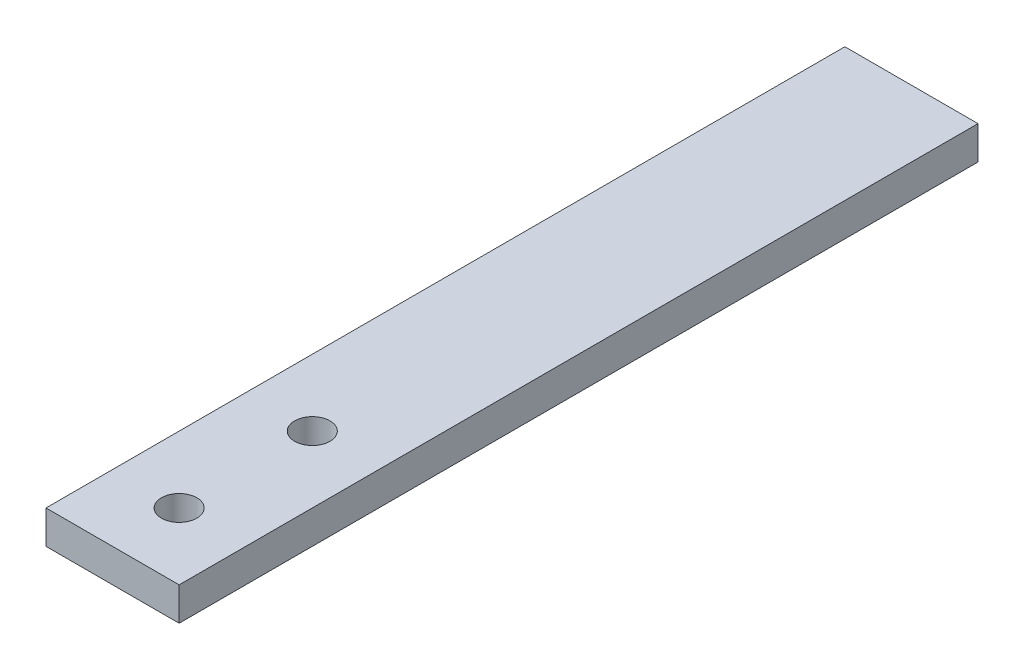
ISO-10303-21;
HEADER;
FILE_DESCRIPTION(('STEP AP214'),'2;1');
FILE_NAME('part.step','',(''),(''),'','','');
FILE_SCHEMA(('AUTOMOTIVE_DESIGN { 1 0 10303 214 1 1 1 1 }'));
ENDSEC;
DATA;
#1=APPLICATION_CONTEXT('core data for automotive mechanical design processes');
#2=APPLICATION_PROTOCOL_DEFINITION('international standard','automotive_design',2000,#1);
#3=PRODUCT_CONTEXT('',#1,'mechanical');
#4=PRODUCT('Part','Part','',(#3));
#5=PRODUCT_RELATED_PRODUCT_CATEGORY('part','',(#4));
#6=PRODUCT_DEFINITION_FORMATION('','',#4);
#7=PRODUCT_DEFINITION_CONTEXT('part definition',#1,'design');
#8=PRODUCT_DEFINITION('design','',#6,#7);
#9=PRODUCT_DEFINITION_SHAPE('','',#8);
#10=(LENGTH_UNIT() NAMED_UNIT(*) SI_UNIT(.MILLI.,.METRE.));
#11=(NAMED_UNIT(*) PLANE_ANGLE_UNIT() SI_UNIT($,.RADIAN.));
#12=(NAMED_UNIT(*) SI_UNIT($,.STERADIAN.) SOLID_ANGLE_UNIT());
#13=UNCERTAINTY_MEASURE_WITH_UNIT(LENGTH_MEASURE(1.E-05),#10,'distance_accuracy_value','');
#14=(GEOMETRIC_REPRESENTATION_CONTEXT(3) GLOBAL_UNCERTAINTY_ASSIGNED_CONTEXT((#13)) GLOBAL_UNIT_ASSIGNED_CONTEXT((#10,
#11,#12)) REPRESENTATION_CONTEXT('',''));
#15=CARTESIAN_POINT('',(0.,0.,0.));
#16=DIRECTION('',(0.,0.,1.));
#17=DIRECTION('',(1.,0.,0.));
#18=AXIS2_PLACEMENT_3D('',#15,#16,#17);
#19=CARTESIAN_POINT('',(-12.7,3.175,76.2));
#20=DIRECTION('',(-1.,0.,0.));
#21=DIRECTION('',(0.,0.,1.));
#22=AXIS2_PLACEMENT_3D('',#19,#20,#21);
#23=PLANE('',#22);
#24=DIRECTION('',(0.,0.,-1.));
#25=VECTOR('',#24,1.);
#26=CARTESIAN_POINT('',(-12.7,-3.175,76.2));
#27=LINE('',#26,#25);
#28=CARTESIAN_POINT('',(-12.7,-3.175,76.2));
#29=VERTEX_POINT('',#28);
#30=CARTESIAN_POINT('',(-12.7,-3.175,-76.2));
#31=VERTEX_POINT('',#30);
#32=EDGE_CURVE('E111',#29,#31,#27,.T.);
#33=ORIENTED_EDGE('',*,*,#32,.F.);
#34=DIRECTION('',(0.,-1.,0.));
#35=VECTOR('',#34,1.);
#36=CARTESIAN_POINT('',(-12.7,3.175,76.2));
#37=LINE('',#36,#35);
#38=CARTESIAN_POINT('',(-12.7,3.175,76.2));
#39=VERTEX_POINT('',#38);
#40=EDGE_CURVE('E11',#39,#29,#37,.T.);
#41=ORIENTED_EDGE('',*,*,#40,.F.);
#42=DIRECTION('',(0.,0.,-1.));
#43=VECTOR('',#42,1.);
#44=CARTESIAN_POINT('',(-12.7,3.175,76.2));
#45=LINE('',#44,#43);
#46=CARTESIAN_POINT('',(-12.7,3.175,-76.2));
#47=VERTEX_POINT('',#46);
#48=EDGE_CURVE('E103',#39,#47,#45,.T.);
#49=ORIENTED_EDGE('',*,*,#48,.T.);
#50=DIRECTION('',(0.,-1.,0.));
#51=VECTOR('',#50,1.);
#52=CARTESIAN_POINT('',(-12.7,3.175,-76.2));
#53=LINE('',#52,#51);
#54=EDGE_CURVE('E42',#47,#31,#53,.T.);
#55=ORIENTED_EDGE('',*,*,#54,.T.);
#56=EDGE_LOOP('',(#33,#41,#49,#55));
#57=FACE_BOUND('',#56,.T.);
#58=ADVANCED_FACE('F39',(#57),#23,.T.);
#59=CARTESIAN_POINT('',(-12.7,3.175,76.2));
#60=DIRECTION('',(0.,0.,-1.));
#61=DIRECTION('',(-1.,0.,0.));
#62=AXIS2_PLACEMENT_3D('',#59,#60,#61);
#63=PLANE('',#62);
#64=DIRECTION('',(1.,0.,0.));
#65=VECTOR('',#64,1.);
#66=CARTESIAN_POINT('',(-12.7,-3.175,76.2));
#67=LINE('',#66,#65);
#68=CARTESIAN_POINT('',(12.7,-3.175,76.2));
#69=VERTEX_POINT('',#68);
#70=EDGE_CURVE('E73',#29,#69,#67,.T.);
#71=ORIENTED_EDGE('',*,*,#70,.T.);
#72=DIRECTION('',(0.,-1.,0.));
#73=VECTOR('',#72,1.);
#74=CARTESIAN_POINT('',(12.7,3.175,76.2));
#75=LINE('',#74,#73);
#76=CARTESIAN_POINT('',(12.7,3.175,76.2));
#77=VERTEX_POINT('',#76);
#78=EDGE_CURVE('E49',#77,#69,#75,.T.);
#79=ORIENTED_EDGE('',*,*,#78,.F.);
#80=DIRECTION('',(1.,0.,0.));
#81=VECTOR('',#80,1.);
#82=CARTESIAN_POINT('',(-12.7,3.175,76.2));
#83=LINE('',#82,#81);
#84=EDGE_CURVE('E90',#39,#77,#83,.T.);
#85=ORIENTED_EDGE('',*,*,#84,.F.);
#86=ORIENTED_EDGE('',*,*,#40,.T.);
#87=EDGE_LOOP('',(#71,#79,#85,#86));
#88=FACE_BOUND('',#87,.T.);
#89=ADVANCED_FACE('F128',(#88),#63,.F.);
#90=CARTESIAN_POINT('',(12.7,3.175,76.2));
#91=DIRECTION('',(-1.,0.,0.));
#92=DIRECTION('',(0.,0.,1.));
#93=AXIS2_PLACEMENT_3D('',#90,#91,#92);
#94=PLANE('',#93);
#95=DIRECTION('',(0.,0.,-1.));
#96=VECTOR('',#95,1.);
#97=CARTESIAN_POINT('',(12.7,-3.175,76.2));
#98=LINE('',#97,#96);
#99=CARTESIAN_POINT('',(12.7,-3.175,-76.2));
#100=VERTEX_POINT('',#99);
#101=EDGE_CURVE('E98',#69,#100,#98,.T.);
#102=ORIENTED_EDGE('',*,*,#101,.T.);
#103=DIRECTION('',(0.,-1.,0.));
#104=VECTOR('',#103,1.);
#105=CARTESIAN_POINT('',(12.7,3.175,-76.2));
#106=LINE('',#105,#104);
#107=CARTESIAN_POINT('',(12.7,3.175,-76.2));
#108=VERTEX_POINT('',#107);
#109=EDGE_CURVE('E95',#108,#100,#106,.T.);
#110=ORIENTED_EDGE('',*,*,#109,.F.);
#111=DIRECTION('',(0.,0.,-1.));
#112=VECTOR('',#111,1.);
#113=CARTESIAN_POINT('',(12.7,3.175,76.2));
#114=LINE('',#113,#112);
#115=EDGE_CURVE('E85',#77,#108,#114,.T.);
#116=ORIENTED_EDGE('',*,*,#115,.F.);
#117=ORIENTED_EDGE('',*,*,#78,.T.);
#118=EDGE_LOOP('',(#102,#110,#116,#117));
#119=FACE_BOUND('',#118,.T.);
#120=ADVANCED_FACE('F96',(#119),#94,.F.);
#121=CARTESIAN_POINT('',(-12.7,3.175,-76.2));
#122=DIRECTION('',(0.,0.,-1.));
#123=DIRECTION('',(-1.,0.,0.));
#124=AXIS2_PLACEMENT_3D('',#121,#122,#123);
#125=PLANE('',#124);
#126=DIRECTION('',(1.,0.,0.));
#127=VECTOR('',#126,1.);
#128=CARTESIAN_POINT('',(-12.7,-3.175,-76.2));
#129=LINE('',#128,#127);
#130=EDGE_CURVE('E115',#31,#100,#129,.T.);
#131=ORIENTED_EDGE('',*,*,#130,.F.);
#132=ORIENTED_EDGE('',*,*,#54,.F.);
#133=DIRECTION('',(1.,0.,0.));
#134=VECTOR('',#133,1.);
#135=CARTESIAN_POINT('',(-12.7,3.175,-76.2));
#136=LINE('',#135,#134);
#137=EDGE_CURVE('E89',#47,#108,#136,.T.);
#138=ORIENTED_EDGE('',*,*,#137,.T.);
#139=ORIENTED_EDGE('',*,*,#109,.T.);
#140=EDGE_LOOP('',(#131,#132,#138,#139));
#141=FACE_BOUND('',#140,.T.);
#142=ADVANCED_FACE('F101',(#141),#125,.T.);
#143=CARTESIAN_POINT('',(0.,3.175,0.));
#144=DIRECTION('',(0.,-1.,0.));
#145=DIRECTION('',(0.,0.,-1.));
#146=AXIS2_PLACEMENT_3D('',#143,#144,#145);
#147=PLANE('',#146);
#148=CARTESIAN_POINT('',(0.,3.175,63.5));
#149=DIRECTION('',(0.,1.,0.));
#150=DIRECTION('',(0.,0.,1.));
#151=AXIS2_PLACEMENT_3D('',#148,#149,#150);
#152=CIRCLE('',#151,3.37819999999999);
#153=CARTESIAN_POINT('',(0.,3.175,66.8782));
#154=VERTEX_POINT('',#153);
#155=EDGE_CURVE('E165',#154,#154,#152,.T.);
#156=ORIENTED_EDGE('',*,*,#155,.F.);
#157=EDGE_LOOP('',(#156));
#158=FACE_BOUND('',#157,.T.);
#159=CARTESIAN_POINT('',(0.,3.175,38.1));
#160=DIRECTION('',(0.,1.,0.));
#161=DIRECTION('',(0.,0.,1.));
#162=AXIS2_PLACEMENT_3D('',#159,#160,#161);
#163=CIRCLE('',#162,3.37819999999999);
#164=CARTESIAN_POINT('',(0.,3.175,41.4782));
#165=VERTEX_POINT('',#164);
#166=EDGE_CURVE('E169',#165,#165,#163,.T.);
#167=ORIENTED_EDGE('',*,*,#166,.F.);
#168=EDGE_LOOP('',(#167));
#169=FACE_BOUND('',#168,.T.);
#170=ORIENTED_EDGE('',*,*,#48,.F.);
#171=ORIENTED_EDGE('',*,*,#84,.T.);
#172=ORIENTED_EDGE('',*,*,#115,.T.);
#173=ORIENTED_EDGE('',*,*,#137,.F.);
#174=EDGE_LOOP('',(#170,#171,#172,#173));
#175=FACE_BOUND('',#174,.T.);
#176=ADVANCED_FACE('F88',(#158,#169,#175),#147,.F.);
#177=CARTESIAN_POINT('',(0.,-3.175,0.));
#178=DIRECTION('',(0.,-1.,0.));
#179=DIRECTION('',(0.,0.,-1.));
#180=AXIS2_PLACEMENT_3D('',#177,#178,#179);
#181=PLANE('',#180);
#182=CARTESIAN_POINT('',(0.,-3.17499999999999,63.5));
#183=DIRECTION('',(0.,1.,0.));
#184=DIRECTION('',(0.,0.,1.));
#185=AXIS2_PLACEMENT_3D('',#182,#183,#184);
#186=CIRCLE('',#185,3.37819999999999);
#187=CARTESIAN_POINT('',(0.,-3.17499999999999,66.8782));
#188=VERTEX_POINT('',#187);
#189=EDGE_CURVE('E163',#188,#188,#186,.T.);
#190=ORIENTED_EDGE('',*,*,#189,.T.);
#191=EDGE_LOOP('',(#190));
#192=FACE_BOUND('',#191,.T.);
#193=CARTESIAN_POINT('',(0.,-3.17499999999999,38.1));
#194=DIRECTION('',(0.,1.,0.));
#195=DIRECTION('',(0.,0.,1.));
#196=AXIS2_PLACEMENT_3D('',#193,#194,#195);
#197=CIRCLE('',#196,3.37819999999999);
#198=CARTESIAN_POINT('',(0.,-3.17499999999999,41.4782));
#199=VERTEX_POINT('',#198);
#200=EDGE_CURVE('E116',#199,#199,#197,.T.);
#201=ORIENTED_EDGE('',*,*,#200,.T.);
#202=EDGE_LOOP('',(#201));
#203=FACE_BOUND('',#202,.T.);
#204=ORIENTED_EDGE('',*,*,#32,.T.);
#205=ORIENTED_EDGE('',*,*,#130,.T.);
#206=ORIENTED_EDGE('',*,*,#101,.F.);
#207=ORIENTED_EDGE('',*,*,#70,.F.);
#208=EDGE_LOOP('',(#204,#205,#206,#207));
#209=FACE_BOUND('',#208,.T.);
#210=ADVANCED_FACE('F125',(#192,#203,#209),#181,.T.);
#211=CARTESIAN_POINT('',(0.,3.175,38.1));
#212=DIRECTION('',(0.,1.,0.));
#213=DIRECTION('',(0.,0.,1.));
#214=AXIS2_PLACEMENT_3D('',#211,#212,#213);
#215=CYLINDRICAL_SURFACE('',#214,3.37819999999999);
#216=ORIENTED_EDGE('',*,*,#200,.F.);
#217=EDGE_LOOP('',(#216));
#218=FACE_BOUND('',#217,.T.);
#219=ORIENTED_EDGE('',*,*,#166,.T.);
#220=EDGE_LOOP('',(#219));
#221=FACE_BOUND('',#220,.T.);
#222=ADVANCED_FACE('F147',(#218,#221),#215,.F.);
#223=CARTESIAN_POINT('',(0.,3.175,63.5));
#224=DIRECTION('',(0.,1.,0.));
#225=DIRECTION('',(0.,0.,1.));
#226=AXIS2_PLACEMENT_3D('',#223,#224,#225);
#227=CYLINDRICAL_SURFACE('',#226,3.37819999999999);
#228=ORIENTED_EDGE('',*,*,#189,.F.);
#229=EDGE_LOOP('',(#228));
#230=FACE_BOUND('',#229,.T.);
#231=ORIENTED_EDGE('',*,*,#155,.T.);
#232=EDGE_LOOP('',(#231));
#233=FACE_BOUND('',#232,.T.);
#234=ADVANCED_FACE('F154',(#230,#233),#227,.F.);
#235=CLOSED_SHELL('',(#58,#89,#120,#142,#176,#210,#222,#234));
#236=MANIFOLD_SOLID_BREP('B2',#235);
#237=ADVANCED_BREP_SHAPE_REPRESENTATION('',(#18,#236),#14);
#238=SHAPE_DEFINITION_REPRESENTATION(#9,#237);
ENDSEC;
END-ISO-10303-21;
